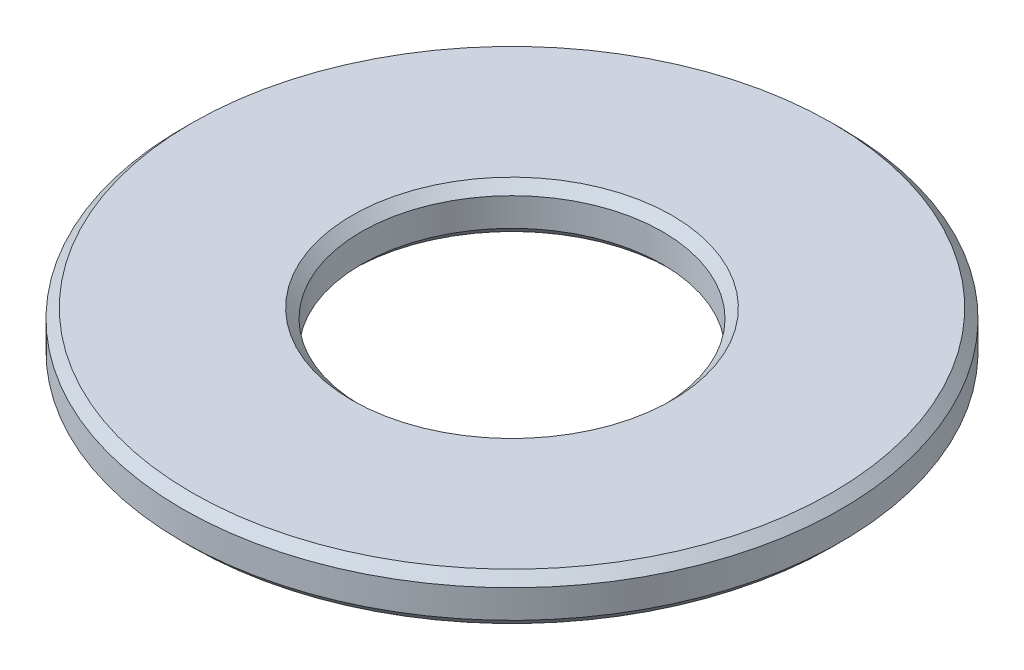
ISO-10303-21;
HEADER;
FILE_DESCRIPTION(('STEP AP214'),'2;1');
FILE_NAME('part.step','',(''),(''),'','','');
FILE_SCHEMA(('AUTOMOTIVE_DESIGN { 1 0 10303 214 1 1 1 1 }'));
ENDSEC;
DATA;
#1=APPLICATION_CONTEXT('core data for automotive mechanical design processes');
#2=APPLICATION_PROTOCOL_DEFINITION('international standard','automotive_design',2000,#1);
#3=PRODUCT_CONTEXT('',#1,'mechanical');
#4=PRODUCT('Part','Part','',(#3));
#5=PRODUCT_RELATED_PRODUCT_CATEGORY('part','',(#4));
#6=PRODUCT_DEFINITION_FORMATION('','',#4);
#7=PRODUCT_DEFINITION_CONTEXT('part definition',#1,'design');
#8=PRODUCT_DEFINITION('design','',#6,#7);
#9=PRODUCT_DEFINITION_SHAPE('','',#8);
#10=(LENGTH_UNIT() NAMED_UNIT(*) SI_UNIT(.MILLI.,.METRE.));
#11=(NAMED_UNIT(*) PLANE_ANGLE_UNIT() SI_UNIT($,.RADIAN.));
#12=(NAMED_UNIT(*) SI_UNIT($,.STERADIAN.) SOLID_ANGLE_UNIT());
#13=UNCERTAINTY_MEASURE_WITH_UNIT(LENGTH_MEASURE(1.E-05),#10,'distance_accuracy_value','');
#14=(GEOMETRIC_REPRESENTATION_CONTEXT(3) GLOBAL_UNCERTAINTY_ASSIGNED_CONTEXT((#13)) GLOBAL_UNIT_ASSIGNED_CONTEXT((#10,
#11,#12)) REPRESENTATION_CONTEXT('',''));
#15=CARTESIAN_POINT('',(0.,0.,0.));
#16=DIRECTION('',(0.,0.,1.));
#17=DIRECTION('',(1.,0.,0.));
#18=AXIS2_PLACEMENT_3D('',#15,#16,#17);
#19=CARTESIAN_POINT('',(0.,0.5,0.));
#20=DIRECTION('',(0.,1.,0.));
#21=DIRECTION('',(0.,0.,1.));
#22=AXIS2_PLACEMENT_3D('',#19,#20,#21);
#23=PLANE('',#22);
#24=CARTESIAN_POINT('',(0.,0.5,0.));
#25=DIRECTION('',(0.,1.,0.));
#26=DIRECTION('',(0.,0.,1.));
#27=AXIS2_PLACEMENT_3D('',#24,#25,#26);
#28=CIRCLE('',#27,3.4);
#29=CARTESIAN_POINT('',(0.,0.5,3.4));
#30=VERTEX_POINT('',#29);
#31=EDGE_CURVE('E10',#30,#30,#28,.T.);
#32=ORIENTED_EDGE('',*,*,#31,.T.);
#33=EDGE_LOOP('',(#32));
#34=FACE_BOUND('',#33,.T.);
#35=CARTESIAN_POINT('',(0.,0.5,0.));
#36=DIRECTION('',(0.,1.,0.));
#37=DIRECTION('',(0.,0.,1.));
#38=AXIS2_PLACEMENT_3D('',#35,#36,#37);
#39=CIRCLE('',#38,1.7);
#40=CARTESIAN_POINT('',(0.,0.5,1.7));
#41=VERTEX_POINT('',#40);
#42=EDGE_CURVE('E42',#41,#41,#39,.F.);
#43=ORIENTED_EDGE('',*,*,#42,.T.);
#44=EDGE_LOOP('',(#43));
#45=FACE_BOUND('',#44,.T.);
#46=ADVANCED_FACE('F34',(#34,#45),#23,.T.);
#47=CARTESIAN_POINT('',(0.,0.,0.));
#48=DIRECTION('',(0.,1.,0.));
#49=DIRECTION('',(0.,0.,1.));
#50=AXIS2_PLACEMENT_3D('',#47,#48,#49);
#51=PLANE('',#50);
#52=CARTESIAN_POINT('',(0.,0.,0.));
#53=DIRECTION('',(0.,1.,0.));
#54=DIRECTION('',(0.,0.,1.));
#55=AXIS2_PLACEMENT_3D('',#52,#53,#54);
#56=CIRCLE('',#55,1.7);
#57=CARTESIAN_POINT('',(0.,0.,1.7));
#58=VERTEX_POINT('',#57);
#59=EDGE_CURVE('E61',#58,#58,#56,.T.);
#60=ORIENTED_EDGE('',*,*,#59,.T.);
#61=EDGE_LOOP('',(#60));
#62=FACE_BOUND('',#61,.T.);
#63=CARTESIAN_POINT('',(0.,0.,0.));
#64=DIRECTION('',(0.,1.,0.));
#65=DIRECTION('',(0.,0.,1.));
#66=AXIS2_PLACEMENT_3D('',#63,#64,#65);
#67=CIRCLE('',#66,3.4);
#68=CARTESIAN_POINT('',(0.,0.,3.4));
#69=VERTEX_POINT('',#68);
#70=EDGE_CURVE('E64',#69,#69,#67,.F.);
#71=ORIENTED_EDGE('',*,*,#70,.T.);
#72=EDGE_LOOP('',(#71));
#73=FACE_BOUND('',#72,.T.);
#74=ADVANCED_FACE('F68',(#62,#73),#51,.F.);
#75=CARTESIAN_POINT('',(0.,0.5,0.));
#76=DIRECTION('',(0.,-1.,0.));
#77=DIRECTION('',(0.,0.,-1.));
#78=AXIS2_PLACEMENT_3D('',#75,#76,#77);
#79=CYLINDRICAL_SURFACE('',#78,3.5);
#80=CARTESIAN_POINT('',(0.,0.0999999999999994,0.));
#81=DIRECTION('',(0.,1.,0.));
#82=DIRECTION('',(0.,0.,1.));
#83=AXIS2_PLACEMENT_3D('',#80,#81,#82);
#84=CIRCLE('',#83,3.5);
#85=CARTESIAN_POINT('',(0.,0.0999999999999994,3.5));
#86=VERTEX_POINT('',#85);
#87=EDGE_CURVE('E46',#86,#86,#84,.T.);
#88=ORIENTED_EDGE('',*,*,#87,.T.);
#89=EDGE_LOOP('',(#88));
#90=FACE_BOUND('',#89,.T.);
#91=CARTESIAN_POINT('',(0.,0.399999999999999,0.));
#92=DIRECTION('',(0.,1.,0.));
#93=DIRECTION('',(0.,0.,1.));
#94=AXIS2_PLACEMENT_3D('',#91,#92,#93);
#95=CIRCLE('',#94,3.5);
#96=CARTESIAN_POINT('',(0.,0.399999999999999,3.5));
#97=VERTEX_POINT('',#96);
#98=EDGE_CURVE('E50',#97,#97,#95,.F.);
#99=ORIENTED_EDGE('',*,*,#98,.T.);
#100=EDGE_LOOP('',(#99));
#101=FACE_BOUND('',#100,.T.);
#102=ADVANCED_FACE('F78',(#90,#101),#79,.T.);
#103=CARTESIAN_POINT('',(0.,0.5,0.));
#104=DIRECTION('',(0.,-1.,0.));
#105=DIRECTION('',(0.,0.,-1.));
#106=AXIS2_PLACEMENT_3D('',#103,#104,#105);
#107=CYLINDRICAL_SURFACE('',#106,1.6);
#108=CARTESIAN_POINT('',(0.,0.100000000000001,0.));
#109=DIRECTION('',(0.,1.,0.));
#110=DIRECTION('',(0.,0.,1.));
#111=AXIS2_PLACEMENT_3D('',#108,#109,#110);
#112=CIRCLE('',#111,1.6);
#113=CARTESIAN_POINT('',(0.,0.100000000000001,1.6));
#114=VERTEX_POINT('',#113);
#115=EDGE_CURVE('E55',#114,#114,#112,.F.);
#116=ORIENTED_EDGE('',*,*,#115,.T.);
#117=EDGE_LOOP('',(#116));
#118=FACE_BOUND('',#117,.T.);
#119=CARTESIAN_POINT('',(0.,0.400000000000002,0.));
#120=DIRECTION('',(0.,1.,0.));
#121=DIRECTION('',(0.,0.,1.));
#122=AXIS2_PLACEMENT_3D('',#119,#120,#121);
#123=CIRCLE('',#122,1.6);
#124=CARTESIAN_POINT('',(0.,0.400000000000002,1.6));
#125=VERTEX_POINT('',#124);
#126=EDGE_CURVE('E58',#125,#125,#123,.T.);
#127=ORIENTED_EDGE('',*,*,#126,.T.);
#128=EDGE_LOOP('',(#127));
#129=FACE_BOUND('',#128,.T.);
#130=ADVANCED_FACE('F81',(#118,#129),#107,.F.);
#131=CARTESIAN_POINT('',(0.,0.,0.));
#132=DIRECTION('',(0.,-1.,0.));
#133=DIRECTION('',(0.,0.,-1.));
#134=AXIS2_PLACEMENT_3D('',#131,#132,#133);
#135=CONICAL_SURFACE('',#134,1.7,0.785398163397444);
#136=ORIENTED_EDGE('',*,*,#115,.F.);
#137=EDGE_LOOP('',(#136));
#138=FACE_BOUND('',#137,.T.);
#139=ORIENTED_EDGE('',*,*,#59,.F.);
#140=EDGE_LOOP('',(#139));
#141=FACE_BOUND('',#140,.T.);
#142=ADVANCED_FACE('F74',(#138,#141),#135,.F.);
#143=CARTESIAN_POINT('',(0.,0.0999999999999994,0.));
#144=DIRECTION('',(0.,1.,0.));
#145=DIRECTION('',(0.,0.,1.));
#146=AXIS2_PLACEMENT_3D('',#143,#144,#145);
#147=CONICAL_SURFACE('',#146,3.5,0.78539816339745);
#148=ORIENTED_EDGE('',*,*,#70,.F.);
#149=EDGE_LOOP('',(#148));
#150=FACE_BOUND('',#149,.T.);
#151=ORIENTED_EDGE('',*,*,#87,.F.);
#152=EDGE_LOOP('',(#151));
#153=FACE_BOUND('',#152,.T.);
#154=ADVANCED_FACE('F70',(#150,#153),#147,.T.);
#155=CARTESIAN_POINT('',(0.,0.5,0.));
#156=DIRECTION('',(0.,-1.,0.));
#157=DIRECTION('',(0.,0.,-1.));
#158=AXIS2_PLACEMENT_3D('',#155,#156,#157);
#159=CONICAL_SURFACE('',#158,3.4,0.785398163397442);
#160=ORIENTED_EDGE('',*,*,#98,.F.);
#161=EDGE_LOOP('',(#160));
#162=FACE_BOUND('',#161,.T.);
#163=ORIENTED_EDGE('',*,*,#31,.F.);
#164=EDGE_LOOP('',(#163));
#165=FACE_BOUND('',#164,.T.);
#166=ADVANCED_FACE('F73',(#162,#165),#159,.T.);
#167=CARTESIAN_POINT('',(0.,0.400000000000002,0.));
#168=DIRECTION('',(0.,1.,0.));
#169=DIRECTION('',(0.,0.,1.));
#170=AXIS2_PLACEMENT_3D('',#167,#168,#169);
#171=CONICAL_SURFACE('',#170,1.6,0.785398163397448);
#172=ORIENTED_EDGE('',*,*,#42,.F.);
#173=EDGE_LOOP('',(#172));
#174=FACE_BOUND('',#173,.T.);
#175=ORIENTED_EDGE('',*,*,#126,.F.);
#176=EDGE_LOOP('',(#175));
#177=FACE_BOUND('',#176,.T.);
#178=ADVANCED_FACE('F37',(#174,#177),#171,.F.);
#179=CLOSED_SHELL('',(#46,#74,#102,#130,#142,#154,#166,#178));
#180=MANIFOLD_SOLID_BREP('B2',#179);
#181=ADVANCED_BREP_SHAPE_REPRESENTATION('',(#18,#180),#14);
#182=SHAPE_DEFINITION_REPRESENTATION(#9,#181);
ENDSEC;
END-ISO-10303-21;
